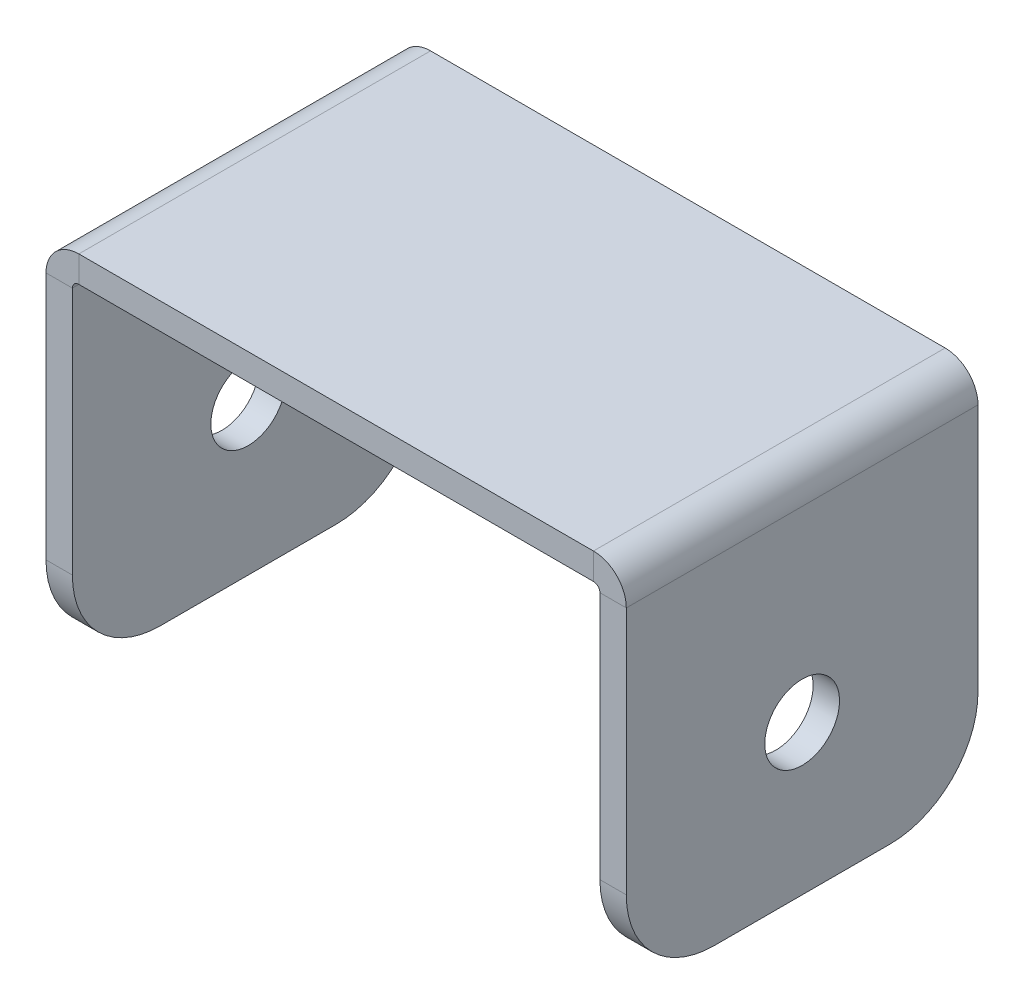
ISO-10303-21;
HEADER;
FILE_DESCRIPTION(('STEP AP214'),'2;1');
FILE_NAME('part.step','',(''),(''),'','','');
FILE_SCHEMA(('AUTOMOTIVE_DESIGN { 1 0 10303 214 1 1 1 1 }'));
ENDSEC;
DATA;
#1=APPLICATION_CONTEXT('core data for automotive mechanical design processes');
#2=APPLICATION_PROTOCOL_DEFINITION('international standard','automotive_design',2000,#1);
#3=PRODUCT_CONTEXT('',#1,'mechanical');
#4=PRODUCT('Part','Part','',(#3));
#5=PRODUCT_RELATED_PRODUCT_CATEGORY('part','',(#4));
#6=PRODUCT_DEFINITION_FORMATION('','',#4);
#7=PRODUCT_DEFINITION_CONTEXT('part definition',#1,'design');
#8=PRODUCT_DEFINITION('design','',#6,#7);
#9=PRODUCT_DEFINITION_SHAPE('','',#8);
#10=(LENGTH_UNIT() NAMED_UNIT(*) SI_UNIT(.MILLI.,.METRE.));
#11=(NAMED_UNIT(*) PLANE_ANGLE_UNIT() SI_UNIT($,.RADIAN.));
#12=(NAMED_UNIT(*) SI_UNIT($,.STERADIAN.) SOLID_ANGLE_UNIT());
#13=UNCERTAINTY_MEASURE_WITH_UNIT(LENGTH_MEASURE(1.E-05),#10,'distance_accuracy_value','');
#14=(GEOMETRIC_REPRESENTATION_CONTEXT(3) GLOBAL_UNCERTAINTY_ASSIGNED_CONTEXT((#13)) GLOBAL_UNIT_ASSIGNED_CONTEXT((#10,
#11,#12)) REPRESENTATION_CONTEXT('',''));
#15=CARTESIAN_POINT('',(0.,0.,0.));
#16=DIRECTION('',(0.,0.,1.));
#17=DIRECTION('',(1.,0.,0.));
#18=AXIS2_PLACEMENT_3D('',#15,#16,#17);
#19=CARTESIAN_POINT('',(0.7366,39.,-40.));
#20=DIRECTION('',(0.,0.,-1.));
#21=DIRECTION('',(-1.,0.,0.));
#22=AXIS2_PLACEMENT_3D('',#19,#20,#21);
#23=PLANE('',#22);
#24=DIRECTION('',(0.,1.,0.));
#25=VECTOR('',#24,1.);
#26=CARTESIAN_POINT('',(0.7366,39.,-40.));
#27=LINE('',#26,#25);
#28=CARTESIAN_POINT('',(0.7366,39.,-40.));
#29=VERTEX_POINT('',#28);
#30=CARTESIAN_POINT('',(0.7366,42.,-40.));
#31=VERTEX_POINT('',#30);
#32=EDGE_CURVE('E274',#29,#31,#27,.T.);
#33=ORIENTED_EDGE('',*,*,#32,.F.);
#34=CARTESIAN_POINT('',(0.7366,38.2634,-40.));
#35=DIRECTION('',(0.,0.,1.));
#36=DIRECTION('',(1.,0.,0.));
#37=AXIS2_PLACEMENT_3D('',#34,#35,#36);
#38=CIRCLE('',#37,0.7366);
#39=CARTESIAN_POINT('',(0.,38.2634,-40.));
#40=VERTEX_POINT('',#39);
#41=EDGE_CURVE('E201',#40,#29,#38,.F.);
#42=ORIENTED_EDGE('',*,*,#41,.F.);
#43=DIRECTION('',(1.,0.,0.));
#44=VECTOR('',#43,1.);
#45=CARTESIAN_POINT('',(-3.,38.2634,-40.));
#46=LINE('',#45,#44);
#47=CARTESIAN_POINT('',(-3.,38.2634,-40.));
#48=VERTEX_POINT('',#47);
#49=EDGE_CURVE('E271',#48,#40,#46,.T.);
#50=ORIENTED_EDGE('',*,*,#49,.F.);
#51=CARTESIAN_POINT('',(0.7366,38.2634,-40.));
#52=DIRECTION('',(0.,0.,1.));
#53=DIRECTION('',(1.,0.,0.));
#54=AXIS2_PLACEMENT_3D('',#51,#52,#53);
#55=CIRCLE('',#54,3.7366);
#56=EDGE_CURVE('E194',#48,#31,#55,.F.);
#57=ORIENTED_EDGE('',*,*,#56,.T.);
#58=EDGE_LOOP('',(#33,#42,#50,#57));
#59=FACE_BOUND('',#58,.T.);
#60=ADVANCED_FACE('F38',(#59),#23,.T.);
#61=CARTESIAN_POINT('',(-3.,38.2634,-40.));
#62=DIRECTION('',(0.,0.,-1.));
#63=DIRECTION('',(-1.,0.,0.));
#64=AXIS2_PLACEMENT_3D('',#61,#62,#63);
#65=PLANE('',#64);
#66=DIRECTION('',(1.,0.,0.));
#67=VECTOR('',#66,1.);
#68=CARTESIAN_POINT('',(0.,39.,-40.));
#69=LINE('',#68,#67);
#70=CARTESIAN_POINT('',(59.2634,39.,-40.));
#71=VERTEX_POINT('',#70);
#72=EDGE_CURVE('E204',#29,#71,#69,.T.);
#73=ORIENTED_EDGE('',*,*,#72,.F.);
#74=ORIENTED_EDGE('',*,*,#32,.T.);
#75=DIRECTION('',(1.,0.,0.));
#76=VECTOR('',#75,1.);
#77=CARTESIAN_POINT('',(0.,42.,-40.));
#78=LINE('',#77,#76);
#79=CARTESIAN_POINT('',(59.2634,42.,-40.));
#80=VERTEX_POINT('',#79);
#81=EDGE_CURVE('E175',#31,#80,#78,.T.);
#82=ORIENTED_EDGE('',*,*,#81,.T.);
#83=DIRECTION('',(0.,-1.,0.));
#84=VECTOR('',#83,1.);
#85=CARTESIAN_POINT('',(59.2634,42.,-40.));
#86=LINE('',#85,#84);
#87=EDGE_CURVE('E166',#80,#71,#86,.T.);
#88=ORIENTED_EDGE('',*,*,#87,.T.);
#89=EDGE_LOOP('',(#73,#74,#82,#88));
#90=FACE_BOUND('',#89,.T.);
#91=ADVANCED_FACE('F325',(#90),#65,.T.);
#92=CARTESIAN_POINT('',(0.,38.2634,0.));
#93=DIRECTION('',(0.,0.,1.));
#94=DIRECTION('',(1.,0.,0.));
#95=AXIS2_PLACEMENT_3D('',#92,#93,#94);
#96=PLANE('',#95);
#97=DIRECTION('',(-1.,0.,0.));
#98=VECTOR('',#97,1.);
#99=CARTESIAN_POINT('',(0.,38.2634,0.));
#100=LINE('',#99,#98);
#101=CARTESIAN_POINT('',(0.,38.2634,0.));
#102=VERTEX_POINT('',#101);
#103=CARTESIAN_POINT('',(-3.,38.2634,0.));
#104=VERTEX_POINT('',#103);
#105=EDGE_CURVE('E268',#102,#104,#100,.T.);
#106=ORIENTED_EDGE('',*,*,#105,.F.);
#107=CARTESIAN_POINT('',(0.7366,38.2634,0.));
#108=DIRECTION('',(0.,0.,1.));
#109=DIRECTION('',(1.,0.,0.));
#110=AXIS2_PLACEMENT_3D('',#107,#108,#109);
#111=CIRCLE('',#110,0.7366);
#112=CARTESIAN_POINT('',(0.7366,39.,0.));
#113=VERTEX_POINT('',#112);
#114=EDGE_CURVE('E226',#102,#113,#111,.F.);
#115=ORIENTED_EDGE('',*,*,#114,.T.);
#116=DIRECTION('',(0.,-1.,0.));
#117=VECTOR('',#116,1.);
#118=CARTESIAN_POINT('',(0.7366,42.,0.));
#119=LINE('',#118,#117);
#120=CARTESIAN_POINT('',(0.7366,42.,0.));
#121=VERTEX_POINT('',#120);
#122=EDGE_CURVE('E165',#121,#113,#119,.T.);
#123=ORIENTED_EDGE('',*,*,#122,.F.);
#124=CARTESIAN_POINT('',(0.7366,38.2634,0.));
#125=DIRECTION('',(0.,0.,1.));
#126=DIRECTION('',(1.,0.,0.));
#127=AXIS2_PLACEMENT_3D('',#124,#125,#126);
#128=CIRCLE('',#127,3.7366);
#129=EDGE_CURVE('E219',#104,#121,#128,.F.);
#130=ORIENTED_EDGE('',*,*,#129,.F.);
#131=EDGE_LOOP('',(#106,#115,#123,#130));
#132=FACE_BOUND('',#131,.T.);
#133=ADVANCED_FACE('F363',(#132),#96,.T.);
#134=CARTESIAN_POINT('',(0.7366,42.,0.));
#135=DIRECTION('',(0.,0.,1.));
#136=DIRECTION('',(1.,0.,0.));
#137=AXIS2_PLACEMENT_3D('',#134,#135,#136);
#138=PLANE('',#137);
#139=DIRECTION('',(0.,1.,0.));
#140=VECTOR('',#139,1.);
#141=CARTESIAN_POINT('',(-3.,0.,0.));
#142=LINE('',#141,#140);
#143=CARTESIAN_POINT('',(-3.,10.,0.));
#144=VERTEX_POINT('',#143);
#145=EDGE_CURVE('E222',#144,#104,#142,.T.);
#146=ORIENTED_EDGE('',*,*,#145,.F.);
#147=DIRECTION('',(-1.,0.,0.));
#148=VECTOR('',#147,1.);
#149=CARTESIAN_POINT('',(0.,10.,0.));
#150=LINE('',#149,#148);
#151=CARTESIAN_POINT('',(0.,10.,0.));
#152=VERTEX_POINT('',#151);
#153=EDGE_CURVE('E292',#144,#152,#150,.F.);
#154=ORIENTED_EDGE('',*,*,#153,.T.);
#155=DIRECTION('',(0.,1.,0.));
#156=VECTOR('',#155,1.);
#157=CARTESIAN_POINT('',(0.,0.,0.));
#158=LINE('',#157,#156);
#159=EDGE_CURVE('E224',#152,#102,#158,.T.);
#160=ORIENTED_EDGE('',*,*,#159,.T.);
#161=ORIENTED_EDGE('',*,*,#105,.T.);
#162=EDGE_LOOP('',(#146,#154,#160,#161));
#163=FACE_BOUND('',#162,.T.);
#164=ADVANCED_FACE('F414',(#163),#138,.T.);
#165=CARTESIAN_POINT('',(60.,38.2634,-40.));
#166=DIRECTION('',(0.,0.,-1.));
#167=DIRECTION('',(-1.,0.,0.));
#168=AXIS2_PLACEMENT_3D('',#165,#166,#167);
#169=PLANE('',#168);
#170=DIRECTION('',(1.,0.,0.));
#171=VECTOR('',#170,1.);
#172=CARTESIAN_POINT('',(60.,38.2634,-40.));
#173=LINE('',#172,#171);
#174=CARTESIAN_POINT('',(60.,38.2634,-40.));
#175=VERTEX_POINT('',#174);
#176=CARTESIAN_POINT('',(63.,38.2634,-40.));
#177=VERTEX_POINT('',#176);
#178=EDGE_CURVE('E152',#175,#177,#173,.T.);
#179=ORIENTED_EDGE('',*,*,#178,.F.);
#180=CARTESIAN_POINT('',(59.2634,38.2634,-40.));
#181=DIRECTION('',(0.,0.,1.));
#182=DIRECTION('',(1.,0.,0.));
#183=AXIS2_PLACEMENT_3D('',#180,#181,#182);
#184=CIRCLE('',#183,0.7366);
#185=EDGE_CURVE('E207',#71,#175,#184,.F.);
#186=ORIENTED_EDGE('',*,*,#185,.F.);
#187=ORIENTED_EDGE('',*,*,#87,.F.);
#188=CARTESIAN_POINT('',(59.2634,38.2634,-40.));
#189=DIRECTION('',(0.,0.,1.));
#190=DIRECTION('',(1.,0.,0.));
#191=AXIS2_PLACEMENT_3D('',#188,#189,#190);
#192=CIRCLE('',#191,3.7366);
#193=EDGE_CURVE('E169',#80,#177,#192,.F.);
#194=ORIENTED_EDGE('',*,*,#193,.T.);
#195=EDGE_LOOP('',(#179,#186,#187,#194));
#196=FACE_BOUND('',#195,.T.);
#197=ADVANCED_FACE('F171',(#196),#169,.T.);
#198=CARTESIAN_POINT('',(59.2634,42.,-40.));
#199=DIRECTION('',(0.,0.,-1.));
#200=DIRECTION('',(-1.,0.,0.));
#201=AXIS2_PLACEMENT_3D('',#198,#199,#200);
#202=PLANE('',#201);
#203=DIRECTION('',(0.,1.,0.));
#204=VECTOR('',#203,1.);
#205=CARTESIAN_POINT('',(63.,39.,-40.));
#206=LINE('',#205,#204);
#207=CARTESIAN_POINT('',(63.,10.,-40.));
#208=VERTEX_POINT('',#207);
#209=EDGE_CURVE('E157',#177,#208,#206,.F.);
#210=ORIENTED_EDGE('',*,*,#209,.T.);
#211=DIRECTION('',(-1.,0.,0.));
#212=VECTOR('',#211,1.);
#213=CARTESIAN_POINT('',(60.,10.,-40.));
#214=LINE('',#213,#212);
#215=CARTESIAN_POINT('',(60.,10.,-40.));
#216=VERTEX_POINT('',#215);
#217=EDGE_CURVE('E294',#208,#216,#214,.T.);
#218=ORIENTED_EDGE('',*,*,#217,.T.);
#219=DIRECTION('',(0.,-1.,0.));
#220=VECTOR('',#219,1.);
#221=CARTESIAN_POINT('',(60.,39.,-40.));
#222=LINE('',#221,#220);
#223=EDGE_CURVE('E160',#175,#216,#222,.T.);
#224=ORIENTED_EDGE('',*,*,#223,.F.);
#225=ORIENTED_EDGE('',*,*,#178,.T.);
#226=EDGE_LOOP('',(#210,#218,#224,#225));
#227=FACE_BOUND('',#226,.T.);
#228=ADVANCED_FACE('F154',(#227),#202,.T.);
#229=CARTESIAN_POINT('',(59.2634,39.,0.));
#230=DIRECTION('',(0.,0.,1.));
#231=DIRECTION('',(1.,0.,0.));
#232=AXIS2_PLACEMENT_3D('',#229,#230,#231);
#233=PLANE('',#232);
#234=DIRECTION('',(0.,1.,0.));
#235=VECTOR('',#234,1.);
#236=CARTESIAN_POINT('',(59.2634,39.,0.));
#237=LINE('',#236,#235);
#238=CARTESIAN_POINT('',(59.2634,39.,0.));
#239=VERTEX_POINT('',#238);
#240=CARTESIAN_POINT('',(59.2634,42.,0.));
#241=VERTEX_POINT('',#240);
#242=EDGE_CURVE('E264',#239,#241,#237,.T.);
#243=ORIENTED_EDGE('',*,*,#242,.F.);
#244=CARTESIAN_POINT('',(59.2634,38.2634,0.));
#245=DIRECTION('',(0.,0.,1.));
#246=DIRECTION('',(1.,0.,0.));
#247=AXIS2_PLACEMENT_3D('',#244,#245,#246);
#248=CIRCLE('',#247,0.7366);
#249=CARTESIAN_POINT('',(60.,38.2634,0.));
#250=VERTEX_POINT('',#249);
#251=EDGE_CURVE('E189',#239,#250,#248,.F.);
#252=ORIENTED_EDGE('',*,*,#251,.T.);
#253=DIRECTION('',(-1.,0.,0.));
#254=VECTOR('',#253,1.);
#255=CARTESIAN_POINT('',(63.,38.2634,0.));
#256=LINE('',#255,#254);
#257=CARTESIAN_POINT('',(63.,38.2634,0.));
#258=VERTEX_POINT('',#257);
#259=EDGE_CURVE('E237',#258,#250,#256,.T.);
#260=ORIENTED_EDGE('',*,*,#259,.F.);
#261=CARTESIAN_POINT('',(59.2634,38.2634,0.));
#262=DIRECTION('',(0.,0.,1.));
#263=DIRECTION('',(1.,0.,0.));
#264=AXIS2_PLACEMENT_3D('',#261,#262,#263);
#265=CIRCLE('',#264,3.7366);
#266=EDGE_CURVE('E182',#241,#258,#265,.F.);
#267=ORIENTED_EDGE('',*,*,#266,.F.);
#268=EDGE_LOOP('',(#243,#252,#260,#267));
#269=FACE_BOUND('',#268,.T.);
#270=ADVANCED_FACE('F345',(#269),#233,.T.);
#271=CARTESIAN_POINT('',(63.,38.2634,0.));
#272=DIRECTION('',(0.,0.,1.));
#273=DIRECTION('',(1.,0.,0.));
#274=AXIS2_PLACEMENT_3D('',#271,#272,#273);
#275=PLANE('',#274);
#276=DIRECTION('',(1.,0.,0.));
#277=VECTOR('',#276,1.);
#278=CARTESIAN_POINT('',(0.,39.,0.));
#279=LINE('',#278,#277);
#280=EDGE_CURVE('E229',#113,#239,#279,.T.);
#281=ORIENTED_EDGE('',*,*,#280,.T.);
#282=ORIENTED_EDGE('',*,*,#242,.T.);
#283=DIRECTION('',(1.,0.,0.));
#284=VECTOR('',#283,1.);
#285=CARTESIAN_POINT('',(0.,42.,0.));
#286=LINE('',#285,#284);
#287=EDGE_CURVE('E216',#121,#241,#286,.T.);
#288=ORIENTED_EDGE('',*,*,#287,.F.);
#289=ORIENTED_EDGE('',*,*,#122,.T.);
#290=EDGE_LOOP('',(#281,#282,#288,#289));
#291=FACE_BOUND('',#290,.T.);
#292=ADVANCED_FACE('F398',(#291),#275,.T.);
#293=CARTESIAN_POINT('',(60.,39.,-40.));
#294=DIRECTION('',(-1.,0.,0.));
#295=DIRECTION('',(0.,0.,1.));
#296=AXIS2_PLACEMENT_3D('',#293,#294,#295);
#297=PLANE('',#296);
#298=CARTESIAN_POINT('',(60.,17.,-20.));
#299=DIRECTION('',(-1.,0.,0.));
#300=DIRECTION('',(0.,0.,1.));
#301=AXIS2_PLACEMENT_3D('',#298,#299,#300);
#302=CIRCLE('',#301,4.25);
#303=CARTESIAN_POINT('',(60.,17.,-15.75));
#304=VERTEX_POINT('',#303);
#305=EDGE_CURVE('E213',#304,#304,#302,.T.);
#306=ORIENTED_EDGE('',*,*,#305,.F.);
#307=EDGE_LOOP('',(#306));
#308=FACE_BOUND('',#307,.T.);
#309=ORIENTED_EDGE('',*,*,#223,.T.);
#310=CARTESIAN_POINT('',(60.,10.,-30.));
#311=DIRECTION('',(-1.,0.,0.));
#312=DIRECTION('',(0.,0.,1.));
#313=AXIS2_PLACEMENT_3D('',#310,#311,#312);
#314=CIRCLE('',#313,10.);
#315=CARTESIAN_POINT('',(60.,0.,-30.));
#316=VERTEX_POINT('',#315);
#317=EDGE_CURVE('E298',#216,#316,#314,.T.);
#318=ORIENTED_EDGE('',*,*,#317,.T.);
#319=DIRECTION('',(0.,0.,1.));
#320=VECTOR('',#319,1.);
#321=CARTESIAN_POINT('',(60.,0.,-40.));
#322=LINE('',#321,#320);
#323=CARTESIAN_POINT('',(60.,0.,-10.));
#324=VERTEX_POINT('',#323);
#325=EDGE_CURVE('E209',#316,#324,#322,.T.);
#326=ORIENTED_EDGE('',*,*,#325,.T.);
#327=CARTESIAN_POINT('',(60.,10.,-10.));
#328=DIRECTION('',(-1.,0.,0.));
#329=DIRECTION('',(0.,0.,1.));
#330=AXIS2_PLACEMENT_3D('',#327,#328,#329);
#331=CIRCLE('',#330,10.);
#332=CARTESIAN_POINT('',(60.,10.,0.));
#333=VERTEX_POINT('',#332);
#334=EDGE_CURVE('E296',#324,#333,#331,.T.);
#335=ORIENTED_EDGE('',*,*,#334,.T.);
#336=DIRECTION('',(0.,-1.,0.));
#337=VECTOR('',#336,1.);
#338=CARTESIAN_POINT('',(60.,39.,0.));
#339=LINE('',#338,#337);
#340=EDGE_CURVE('E210',#250,#333,#339,.T.);
#341=ORIENTED_EDGE('',*,*,#340,.F.);
#342=DIRECTION('',(0.,0.,1.));
#343=VECTOR('',#342,1.);
#344=CARTESIAN_POINT('',(60.,38.2634,-40.));
#345=LINE('',#344,#343);
#346=EDGE_CURVE('E234',#175,#250,#345,.T.);
#347=ORIENTED_EDGE('',*,*,#346,.F.);
#348=EDGE_LOOP('',(#309,#318,#326,#335,#341,#347));
#349=FACE_BOUND('',#348,.T.);
#350=ADVANCED_FACE('F313',(#308,#349),#297,.T.);
#351=CARTESIAN_POINT('',(59.2634,38.2634,-40.));
#352=DIRECTION('',(0.,0.,1.));
#353=DIRECTION('',(1.,0.,0.));
#354=AXIS2_PLACEMENT_3D('',#351,#352,#353);
#355=CYLINDRICAL_SURFACE('',#354,0.7366);
#356=ORIENTED_EDGE('',*,*,#251,.F.);
#357=DIRECTION('',(0.,0.,1.));
#358=VECTOR('',#357,1.);
#359=CARTESIAN_POINT('',(59.2634,39.,-40.));
#360=LINE('',#359,#358);
#361=EDGE_CURVE('E238',#71,#239,#360,.T.);
#362=ORIENTED_EDGE('',*,*,#361,.F.);
#363=ORIENTED_EDGE('',*,*,#185,.T.);
#364=ORIENTED_EDGE('',*,*,#346,.T.);
#365=EDGE_LOOP('',(#356,#362,#363,#364));
#366=FACE_BOUND('',#365,.T.);
#367=ADVANCED_FACE('F317',(#366),#355,.F.);
#368=CARTESIAN_POINT('',(0.,39.,-40.));
#369=DIRECTION('',(0.,-1.,0.));
#370=DIRECTION('',(0.,0.,-1.));
#371=AXIS2_PLACEMENT_3D('',#368,#369,#370);
#372=PLANE('',#371);
#373=ORIENTED_EDGE('',*,*,#280,.F.);
#374=DIRECTION('',(0.,0.,1.));
#375=VECTOR('',#374,1.);
#376=CARTESIAN_POINT('',(0.7366,39.,-40.));
#377=LINE('',#376,#375);
#378=EDGE_CURVE('E241',#29,#113,#377,.T.);
#379=ORIENTED_EDGE('',*,*,#378,.F.);
#380=ORIENTED_EDGE('',*,*,#72,.T.);
#381=ORIENTED_EDGE('',*,*,#361,.T.);
#382=EDGE_LOOP('',(#373,#379,#380,#381));
#383=FACE_BOUND('',#382,.T.);
#384=ADVANCED_FACE('F323',(#383),#372,.T.);
#385=CARTESIAN_POINT('',(0.7366,38.2634,-40.));
#386=DIRECTION('',(0.,0.,1.));
#387=DIRECTION('',(1.,0.,0.));
#388=AXIS2_PLACEMENT_3D('',#385,#386,#387);
#389=CYLINDRICAL_SURFACE('',#388,0.7366);
#390=ORIENTED_EDGE('',*,*,#114,.F.);
#391=DIRECTION('',(0.,0.,1.));
#392=VECTOR('',#391,1.);
#393=CARTESIAN_POINT('',(0.,38.2634,-40.));
#394=LINE('',#393,#392);
#395=EDGE_CURVE('E244',#40,#102,#394,.T.);
#396=ORIENTED_EDGE('',*,*,#395,.F.);
#397=ORIENTED_EDGE('',*,*,#41,.T.);
#398=ORIENTED_EDGE('',*,*,#378,.T.);
#399=EDGE_LOOP('',(#390,#396,#397,#398));
#400=FACE_BOUND('',#399,.T.);
#401=ADVANCED_FACE('F330',(#400),#389,.F.);
#402=CARTESIAN_POINT('',(0.,0.,-40.));
#403=DIRECTION('',(1.,0.,0.));
#404=DIRECTION('',(0.,0.,-1.));
#405=AXIS2_PLACEMENT_3D('',#402,#403,#404);
#406=PLANE('',#405);
#407=CARTESIAN_POINT('',(0.,17.,-20.));
#408=DIRECTION('',(1.,0.,0.));
#409=DIRECTION('',(0.,0.,-1.));
#410=AXIS2_PLACEMENT_3D('',#407,#408,#409);
#411=CIRCLE('',#410,4.25);
#412=CARTESIAN_POINT('',(0.,17.,-24.25));
#413=VERTEX_POINT('',#412);
#414=EDGE_CURVE('E642',#413,#413,#411,.T.);
#415=ORIENTED_EDGE('',*,*,#414,.F.);
#416=EDGE_LOOP('',(#415));
#417=FACE_BOUND('',#416,.T.);
#418=DIRECTION('',(0.,0.,1.));
#419=VECTOR('',#418,1.);
#420=CARTESIAN_POINT('',(0.,0.,-40.));
#421=LINE('',#420,#419);
#422=CARTESIAN_POINT('',(0.,0.,-30.));
#423=VERTEX_POINT('',#422);
#424=CARTESIAN_POINT('',(0.,0.,-10.));
#425=VERTEX_POINT('',#424);
#426=EDGE_CURVE('E247',#423,#425,#421,.T.);
#427=ORIENTED_EDGE('',*,*,#426,.F.);
#428=CARTESIAN_POINT('',(0.,10.,-30.));
#429=DIRECTION('',(1.,0.,0.));
#430=DIRECTION('',(0.,0.,-1.));
#431=AXIS2_PLACEMENT_3D('',#428,#429,#430);
#432=CIRCLE('',#431,10.);
#433=CARTESIAN_POINT('',(0.,10.,-40.));
#434=VERTEX_POINT('',#433);
#435=EDGE_CURVE('E290',#423,#434,#432,.T.);
#436=ORIENTED_EDGE('',*,*,#435,.T.);
#437=DIRECTION('',(0.,1.,0.));
#438=VECTOR('',#437,1.);
#439=CARTESIAN_POINT('',(0.,0.,-40.));
#440=LINE('',#439,#438);
#441=EDGE_CURVE('E199',#434,#40,#440,.T.);
#442=ORIENTED_EDGE('',*,*,#441,.T.);
#443=ORIENTED_EDGE('',*,*,#395,.T.);
#444=ORIENTED_EDGE('',*,*,#159,.F.);
#445=CARTESIAN_POINT('',(0.,10.,-10.));
#446=DIRECTION('',(1.,0.,0.));
#447=DIRECTION('',(0.,0.,-1.));
#448=AXIS2_PLACEMENT_3D('',#445,#446,#447);
#449=CIRCLE('',#448,10.);
#450=EDGE_CURVE('E288',#152,#425,#449,.T.);
#451=ORIENTED_EDGE('',*,*,#450,.T.);
#452=EDGE_LOOP('',(#427,#436,#442,#443,#444,#451));
#453=FACE_BOUND('',#452,.T.);
#454=ADVANCED_FACE('F381',(#417,#453),#406,.T.);
#455=CARTESIAN_POINT('',(0.,0.,-40.));
#456=DIRECTION('',(0.,1.,0.));
#457=DIRECTION('',(0.,0.,1.));
#458=AXIS2_PLACEMENT_3D('',#455,#456,#457);
#459=PLANE('',#458);
#460=DIRECTION('',(0.,0.,1.));
#461=VECTOR('',#460,1.);
#462=CARTESIAN_POINT('',(-3.,0.,-40.));
#463=LINE('',#462,#461);
#464=CARTESIAN_POINT('',(-3.,0.,-30.));
#465=VERTEX_POINT('',#464);
#466=CARTESIAN_POINT('',(-3.,0.,-10.));
#467=VERTEX_POINT('',#466);
#468=EDGE_CURVE('E250',#465,#467,#463,.T.);
#469=ORIENTED_EDGE('',*,*,#468,.F.);
#470=DIRECTION('',(-1.,0.,0.));
#471=VECTOR('',#470,1.);
#472=CARTESIAN_POINT('',(0.,0.,-30.));
#473=LINE('',#472,#471);
#474=EDGE_CURVE('E286',#465,#423,#473,.F.);
#475=ORIENTED_EDGE('',*,*,#474,.T.);
#476=ORIENTED_EDGE('',*,*,#426,.T.);
#477=DIRECTION('',(-1.,0.,0.));
#478=VECTOR('',#477,1.);
#479=CARTESIAN_POINT('',(-3.,0.,-10.));
#480=LINE('',#479,#478);
#481=EDGE_CURVE('E283',#425,#467,#480,.T.);
#482=ORIENTED_EDGE('',*,*,#481,.T.);
#483=EDGE_LOOP('',(#469,#475,#476,#482));
#484=FACE_BOUND('',#483,.T.);
#485=ADVANCED_FACE('F385',(#484),#459,.F.);
#486=CARTESIAN_POINT('',(-3.,0.,-40.));
#487=DIRECTION('',(1.,0.,0.));
#488=DIRECTION('',(0.,0.,-1.));
#489=AXIS2_PLACEMENT_3D('',#486,#487,#488);
#490=PLANE('',#489);
#491=CARTESIAN_POINT('',(-3.,17.,-20.));
#492=DIRECTION('',(-1.,0.,0.));
#493=DIRECTION('',(0.,0.,1.));
#494=AXIS2_PLACEMENT_3D('',#491,#492,#493);
#495=CIRCLE('',#494,4.25);
#496=CARTESIAN_POINT('',(-3.,17.,-15.75));
#497=VERTEX_POINT('',#496);
#498=EDGE_CURVE('E645',#497,#497,#495,.T.);
#499=ORIENTED_EDGE('',*,*,#498,.F.);
#500=EDGE_LOOP('',(#499));
#501=FACE_BOUND('',#500,.T.);
#502=DIRECTION('',(0.,1.,0.));
#503=VECTOR('',#502,1.);
#504=CARTESIAN_POINT('',(-3.,0.,-40.));
#505=LINE('',#504,#503);
#506=CARTESIAN_POINT('',(-3.,10.,-40.));
#507=VERTEX_POINT('',#506);
#508=EDGE_CURVE('E197',#507,#48,#505,.T.);
#509=ORIENTED_EDGE('',*,*,#508,.F.);
#510=CARTESIAN_POINT('',(-3.,10.,-30.));
#511=DIRECTION('',(1.,0.,0.));
#512=DIRECTION('',(0.,0.,-1.));
#513=AXIS2_PLACEMENT_3D('',#510,#511,#512);
#514=CIRCLE('',#513,10.);
#515=EDGE_CURVE('E281',#507,#465,#514,.F.);
#516=ORIENTED_EDGE('',*,*,#515,.T.);
#517=ORIENTED_EDGE('',*,*,#468,.T.);
#518=CARTESIAN_POINT('',(-3.,10.,-10.));
#519=DIRECTION('',(1.,0.,0.));
#520=DIRECTION('',(0.,0.,-1.));
#521=AXIS2_PLACEMENT_3D('',#518,#519,#520);
#522=CIRCLE('',#521,10.);
#523=EDGE_CURVE('E279',#467,#144,#522,.F.);
#524=ORIENTED_EDGE('',*,*,#523,.T.);
#525=ORIENTED_EDGE('',*,*,#145,.T.);
#526=DIRECTION('',(0.,0.,1.));
#527=VECTOR('',#526,1.);
#528=CARTESIAN_POINT('',(-3.,38.2634,-40.));
#529=LINE('',#528,#527);
#530=EDGE_CURVE('E253',#48,#104,#529,.T.);
#531=ORIENTED_EDGE('',*,*,#530,.F.);
#532=EDGE_LOOP('',(#509,#516,#517,#524,#525,#531));
#533=FACE_BOUND('',#532,.T.);
#534=ADVANCED_FACE('F393',(#501,#533),#490,.F.);
#535=CARTESIAN_POINT('',(0.7366,38.2634,-40.));
#536=DIRECTION('',(0.,0.,1.));
#537=DIRECTION('',(1.,0.,0.));
#538=AXIS2_PLACEMENT_3D('',#535,#536,#537);
#539=CYLINDRICAL_SURFACE('',#538,3.7366);
#540=ORIENTED_EDGE('',*,*,#129,.T.);
#541=DIRECTION('',(0.,0.,1.));
#542=VECTOR('',#541,1.);
#543=CARTESIAN_POINT('',(0.7366,42.,-40.));
#544=LINE('',#543,#542);
#545=EDGE_CURVE('E256',#31,#121,#544,.T.);
#546=ORIENTED_EDGE('',*,*,#545,.F.);
#547=ORIENTED_EDGE('',*,*,#56,.F.);
#548=ORIENTED_EDGE('',*,*,#530,.T.);
#549=EDGE_LOOP('',(#540,#546,#547,#548));
#550=FACE_BOUND('',#549,.T.);
#551=ADVANCED_FACE('F338',(#550),#539,.T.);
#552=CARTESIAN_POINT('',(0.,42.,-40.));
#553=DIRECTION('',(0.,-1.,0.));
#554=DIRECTION('',(0.,0.,-1.));
#555=AXIS2_PLACEMENT_3D('',#552,#553,#554);
#556=PLANE('',#555);
#557=ORIENTED_EDGE('',*,*,#287,.T.);
#558=DIRECTION('',(0.,0.,1.));
#559=VECTOR('',#558,1.);
#560=CARTESIAN_POINT('',(59.2634,42.,-40.));
#561=LINE('',#560,#559);
#562=EDGE_CURVE('E183',#80,#241,#561,.T.);
#563=ORIENTED_EDGE('',*,*,#562,.F.);
#564=ORIENTED_EDGE('',*,*,#81,.F.);
#565=ORIENTED_EDGE('',*,*,#545,.T.);
#566=EDGE_LOOP('',(#557,#563,#564,#565));
#567=FACE_BOUND('',#566,.T.);
#568=ADVANCED_FACE('F343',(#567),#556,.F.);
#569=CARTESIAN_POINT('',(59.2634,38.2634,-40.));
#570=DIRECTION('',(0.,0.,1.));
#571=DIRECTION('',(1.,0.,0.));
#572=AXIS2_PLACEMENT_3D('',#569,#570,#571);
#573=CYLINDRICAL_SURFACE('',#572,3.7366);
#574=ORIENTED_EDGE('',*,*,#266,.T.);
#575=DIRECTION('',(0.,0.,1.));
#576=VECTOR('',#575,1.);
#577=CARTESIAN_POINT('',(63.,38.2634,-40.));
#578=LINE('',#577,#576);
#579=EDGE_CURVE('E179',#177,#258,#578,.T.);
#580=ORIENTED_EDGE('',*,*,#579,.F.);
#581=ORIENTED_EDGE('',*,*,#193,.F.);
#582=ORIENTED_EDGE('',*,*,#562,.T.);
#583=EDGE_LOOP('',(#574,#580,#581,#582));
#584=FACE_BOUND('',#583,.T.);
#585=ADVANCED_FACE('F180',(#584),#573,.T.);
#586=CARTESIAN_POINT('',(63.,39.,-40.));
#587=DIRECTION('',(-1.,0.,0.));
#588=DIRECTION('',(0.,0.,1.));
#589=AXIS2_PLACEMENT_3D('',#586,#587,#588);
#590=PLANE('',#589);
#591=CARTESIAN_POINT('',(63.,17.,-20.));
#592=DIRECTION('',(-1.,0.,0.));
#593=DIRECTION('',(0.,0.,1.));
#594=AXIS2_PLACEMENT_3D('',#591,#592,#593);
#595=CIRCLE('',#594,4.25);
#596=CARTESIAN_POINT('',(63.,17.,-15.75));
#597=VERTEX_POINT('',#596);
#598=EDGE_CURVE('E646',#597,#597,#595,.T.);
#599=ORIENTED_EDGE('',*,*,#598,.T.);
#600=EDGE_LOOP('',(#599));
#601=FACE_BOUND('',#600,.T.);
#602=DIRECTION('',(0.,0.,1.));
#603=VECTOR('',#602,1.);
#604=CARTESIAN_POINT('',(63.,0.,-40.));
#605=LINE('',#604,#603);
#606=CARTESIAN_POINT('',(63.,0.,-30.));
#607=VERTEX_POINT('',#606);
#608=CARTESIAN_POINT('',(63.,0.,-10.));
#609=VERTEX_POINT('',#608);
#610=EDGE_CURVE('E184',#607,#609,#605,.T.);
#611=ORIENTED_EDGE('',*,*,#610,.F.);
#612=CARTESIAN_POINT('',(63.,10.,-30.));
#613=DIRECTION('',(-1.,0.,0.));
#614=DIRECTION('',(0.,0.,1.));
#615=AXIS2_PLACEMENT_3D('',#612,#613,#614);
#616=CIRCLE('',#615,10.);
#617=EDGE_CURVE('E46',#607,#208,#616,.F.);
#618=ORIENTED_EDGE('',*,*,#617,.T.);
#619=ORIENTED_EDGE('',*,*,#209,.F.);
#620=ORIENTED_EDGE('',*,*,#579,.T.);
#621=DIRECTION('',(0.,1.,0.));
#622=VECTOR('',#621,1.);
#623=CARTESIAN_POINT('',(63.,39.,0.));
#624=LINE('',#623,#622);
#625=CARTESIAN_POINT('',(63.,10.,0.));
#626=VERTEX_POINT('',#625);
#627=EDGE_CURVE('E212',#258,#626,#624,.F.);
#628=ORIENTED_EDGE('',*,*,#627,.T.);
#629=CARTESIAN_POINT('',(63.,10.,-10.));
#630=DIRECTION('',(-1.,0.,0.));
#631=DIRECTION('',(0.,0.,1.));
#632=AXIS2_PLACEMENT_3D('',#629,#630,#631);
#633=CIRCLE('',#632,10.);
#634=EDGE_CURVE('E58',#626,#609,#633,.F.);
#635=ORIENTED_EDGE('',*,*,#634,.T.);
#636=EDGE_LOOP('',(#611,#618,#619,#620,#628,#635));
#637=FACE_BOUND('',#636,.T.);
#638=ADVANCED_FACE('F186',(#601,#637),#590,.F.);
#639=CARTESIAN_POINT('',(63.,0.,-40.));
#640=DIRECTION('',(0.,1.,0.));
#641=DIRECTION('',(0.,0.,1.));
#642=AXIS2_PLACEMENT_3D('',#639,#640,#641);
#643=PLANE('',#642);
#644=ORIENTED_EDGE('',*,*,#325,.F.);
#645=DIRECTION('',(-1.,0.,0.));
#646=VECTOR('',#645,1.);
#647=CARTESIAN_POINT('',(63.,0.,-30.));
#648=LINE('',#647,#646);
#649=EDGE_CURVE('E303',#316,#607,#648,.F.);
#650=ORIENTED_EDGE('',*,*,#649,.T.);
#651=ORIENTED_EDGE('',*,*,#610,.T.);
#652=DIRECTION('',(-1.,0.,0.));
#653=VECTOR('',#652,1.);
#654=CARTESIAN_POINT('',(60.,0.,-10.));
#655=LINE('',#654,#653);
#656=EDGE_CURVE('E300',#609,#324,#655,.T.);
#657=ORIENTED_EDGE('',*,*,#656,.T.);
#658=EDGE_LOOP('',(#644,#650,#651,#657));
#659=FACE_BOUND('',#658,.T.);
#660=ADVANCED_FACE('F308',(#659),#643,.F.);
#661=CARTESIAN_POINT('',(59.2634,38.2634,-40.));
#662=DIRECTION('',(0.,0.,1.));
#663=DIRECTION('',(1.,0.,0.));
#664=AXIS2_PLACEMENT_3D('',#661,#662,#663);
#665=PLANE('',#664);
#666=ORIENTED_EDGE('',*,*,#441,.F.);
#667=DIRECTION('',(-1.,0.,0.));
#668=VECTOR('',#667,1.);
#669=CARTESIAN_POINT('',(59.2634,10.,-40.));
#670=LINE('',#669,#668);
#671=EDGE_CURVE('E276',#434,#507,#670,.T.);
#672=ORIENTED_EDGE('',*,*,#671,.T.);
#673=ORIENTED_EDGE('',*,*,#508,.T.);
#674=ORIENTED_EDGE('',*,*,#49,.T.);
#675=EDGE_LOOP('',(#666,#672,#673,#674));
#676=FACE_BOUND('',#675,.T.);
#677=ADVANCED_FACE('F390',(#676),#665,.F.);
#678=CARTESIAN_POINT('',(59.2634,38.2634,0.));
#679=DIRECTION('',(0.,0.,1.));
#680=DIRECTION('',(1.,0.,0.));
#681=AXIS2_PLACEMENT_3D('',#678,#679,#680);
#682=PLANE('',#681);
#683=ORIENTED_EDGE('',*,*,#340,.T.);
#684=DIRECTION('',(-1.,0.,0.));
#685=VECTOR('',#684,1.);
#686=CARTESIAN_POINT('',(63.,10.,0.));
#687=LINE('',#686,#685);
#688=EDGE_CURVE('E11',#333,#626,#687,.F.);
#689=ORIENTED_EDGE('',*,*,#688,.T.);
#690=ORIENTED_EDGE('',*,*,#627,.F.);
#691=ORIENTED_EDGE('',*,*,#259,.T.);
#692=EDGE_LOOP('',(#683,#689,#690,#691));
#693=FACE_BOUND('',#692,.T.);
#694=ADVANCED_FACE('F346',(#693),#682,.T.);
#695=CARTESIAN_POINT('',(59.2634,10.,-30.));
#696=DIRECTION('',(-1.,0.,0.));
#697=DIRECTION('',(0.,0.,1.));
#698=AXIS2_PLACEMENT_3D('',#695,#696,#697);
#699=CYLINDRICAL_SURFACE('',#698,10.);
#700=ORIENTED_EDGE('',*,*,#435,.F.);
#701=ORIENTED_EDGE('',*,*,#474,.F.);
#702=ORIENTED_EDGE('',*,*,#515,.F.);
#703=ORIENTED_EDGE('',*,*,#671,.F.);
#704=EDGE_LOOP('',(#700,#701,#702,#703));
#705=FACE_BOUND('',#704,.T.);
#706=ADVANCED_FACE('F367',(#705),#699,.T.);
#707=CARTESIAN_POINT('',(0.,10.,-10.));
#708=DIRECTION('',(1.,0.,0.));
#709=DIRECTION('',(0.,0.,-1.));
#710=AXIS2_PLACEMENT_3D('',#707,#708,#709);
#711=CYLINDRICAL_SURFACE('',#710,10.);
#712=ORIENTED_EDGE('',*,*,#450,.F.);
#713=ORIENTED_EDGE('',*,*,#153,.F.);
#714=ORIENTED_EDGE('',*,*,#523,.F.);
#715=ORIENTED_EDGE('',*,*,#481,.F.);
#716=EDGE_LOOP('',(#712,#713,#714,#715));
#717=FACE_BOUND('',#716,.T.);
#718=ADVANCED_FACE('F357',(#717),#711,.T.);
#719=CARTESIAN_POINT('',(59.2634,10.,-30.));
#720=DIRECTION('',(1.,0.,0.));
#721=DIRECTION('',(0.,0.,-1.));
#722=AXIS2_PLACEMENT_3D('',#719,#720,#721);
#723=CYLINDRICAL_SURFACE('',#722,10.);
#724=ORIENTED_EDGE('',*,*,#617,.F.);
#725=ORIENTED_EDGE('',*,*,#649,.F.);
#726=ORIENTED_EDGE('',*,*,#317,.F.);
#727=ORIENTED_EDGE('',*,*,#217,.F.);
#728=EDGE_LOOP('',(#724,#725,#726,#727));
#729=FACE_BOUND('',#728,.T.);
#730=ADVANCED_FACE('F311',(#729),#723,.T.);
#731=CARTESIAN_POINT('',(63.,10.,-10.));
#732=DIRECTION('',(1.,0.,0.));
#733=DIRECTION('',(0.,0.,-1.));
#734=AXIS2_PLACEMENT_3D('',#731,#732,#733);
#735=CYLINDRICAL_SURFACE('',#734,10.);
#736=ORIENTED_EDGE('',*,*,#634,.F.);
#737=ORIENTED_EDGE('',*,*,#688,.F.);
#738=ORIENTED_EDGE('',*,*,#334,.F.);
#739=ORIENTED_EDGE('',*,*,#656,.F.);
#740=EDGE_LOOP('',(#736,#737,#738,#739));
#741=FACE_BOUND('',#740,.T.);
#742=ADVANCED_FACE('F40',(#741),#735,.T.);
#743=CARTESIAN_POINT('',(63.,17.,-20.));
#744=DIRECTION('',(-1.,0.,0.));
#745=DIRECTION('',(0.,0.,1.));
#746=AXIS2_PLACEMENT_3D('',#743,#744,#745);
#747=CYLINDRICAL_SURFACE('',#746,4.25);
#748=ORIENTED_EDGE('',*,*,#305,.T.);
#749=EDGE_LOOP('',(#748));
#750=FACE_BOUND('',#749,.T.);
#751=ORIENTED_EDGE('',*,*,#598,.F.);
#752=EDGE_LOOP('',(#751));
#753=FACE_BOUND('',#752,.T.);
#754=ADVANCED_FACE('F349',(#750,#753),#747,.F.);
#755=ORIENTED_EDGE('',*,*,#414,.T.);
#756=EDGE_LOOP('',(#755));
#757=FACE_BOUND('',#756,.T.);
#758=ORIENTED_EDGE('',*,*,#498,.T.);
#759=EDGE_LOOP('',(#758));
#760=FACE_BOUND('',#759,.T.);
#761=ADVANCED_FACE('F354',(#757,#760),#747,.F.);
#762=CLOSED_SHELL('',(#60,#91,#133,#164,#197,#228,#270,#292,#350,#367,#384,#401,#454,#485,#534,
#551,#568,#585,#638,#660,#677,#694,#706,#718,#730,#742,#754,#761));
#763=MANIFOLD_SOLID_BREP('B2',#762);
#764=ADVANCED_BREP_SHAPE_REPRESENTATION('',(#18,#763),#14);
#765=SHAPE_DEFINITION_REPRESENTATION(#9,#764);
ENDSEC;
END-ISO-10303-21;
